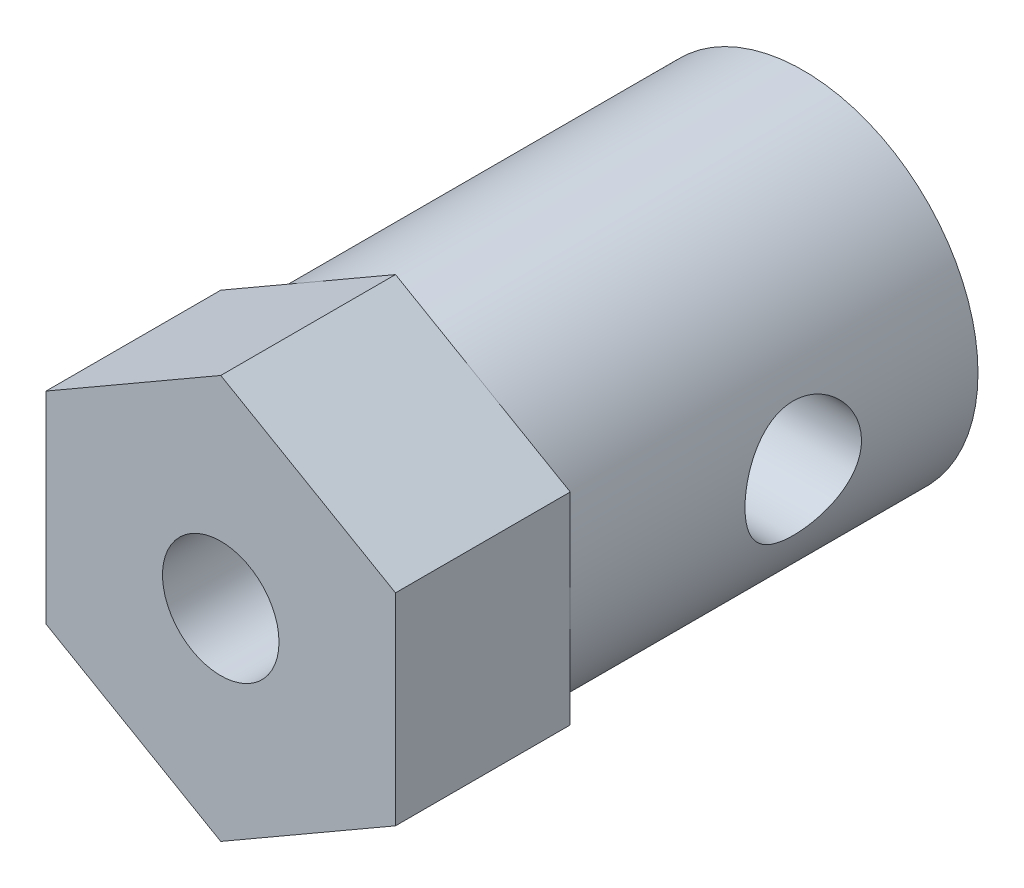
ISO-10303-21;
HEADER;
FILE_DESCRIPTION(('STEP AP214'),'2;1');
FILE_NAME('part.step','',(''),(''),'','','');
FILE_SCHEMA(('AUTOMOTIVE_DESIGN { 1 0 10303 214 1 1 1 1 }'));
ENDSEC;
DATA;
#1=APPLICATION_CONTEXT('core data for automotive mechanical design processes');
#2=APPLICATION_PROTOCOL_DEFINITION('international standard','automotive_design',2000,#1);
#3=PRODUCT_CONTEXT('',#1,'mechanical');
#4=PRODUCT('Part','Part','',(#3));
#5=PRODUCT_RELATED_PRODUCT_CATEGORY('part','',(#4));
#6=PRODUCT_DEFINITION_FORMATION('','',#4);
#7=PRODUCT_DEFINITION_CONTEXT('part definition',#1,'design');
#8=PRODUCT_DEFINITION('design','',#6,#7);
#9=PRODUCT_DEFINITION_SHAPE('','',#8);
#10=(LENGTH_UNIT() NAMED_UNIT(*) SI_UNIT(.MILLI.,.METRE.));
#11=(NAMED_UNIT(*) PLANE_ANGLE_UNIT() SI_UNIT($,.RADIAN.));
#12=(NAMED_UNIT(*) SI_UNIT($,.STERADIAN.) SOLID_ANGLE_UNIT());
#13=UNCERTAINTY_MEASURE_WITH_UNIT(LENGTH_MEASURE(1.E-05),#10,'distance_accuracy_value','');
#14=(GEOMETRIC_REPRESENTATION_CONTEXT(3) GLOBAL_UNCERTAINTY_ASSIGNED_CONTEXT((#13)) GLOBAL_UNIT_ASSIGNED_CONTEXT((#10,
#11,#12)) REPRESENTATION_CONTEXT('',''));
#15=CARTESIAN_POINT('',(0.,0.,0.));
#16=DIRECTION('',(0.,0.,1.));
#17=DIRECTION('',(1.,0.,0.));
#18=AXIS2_PLACEMENT_3D('',#15,#16,#17);
#19=CARTESIAN_POINT('',(0.,0.,118.));
#20=DIRECTION('',(0.,0.,1.));
#21=DIRECTION('',(1.,0.,0.));
#22=AXIS2_PLACEMENT_3D('',#19,#20,#21);
#23=CYLINDRICAL_SURFACE('',#22,2.);
#24=DIRECTION('',(0.,0.,1.));
#25=VECTOR('',#24,1.);
#26=CARTESIAN_POINT('',(2.,0.,118.));
#27=LINE('',#26,#25);
#28=CARTESIAN_POINT('',(2.,0.,118.));
#29=VERTEX_POINT('',#28);
#30=CARTESIAN_POINT('',(2.,0.,124.));
#31=VERTEX_POINT('',#30);
#32=EDGE_CURVE('E11',#29,#31,#27,.T.);
#33=ORIENTED_EDGE('',*,*,#32,.F.);
#34=CARTESIAN_POINT('',(0.,0.,118.));
#35=DIRECTION('',(0.,0.,1.));
#36=DIRECTION('',(1.,0.,0.));
#37=AXIS2_PLACEMENT_3D('',#34,#35,#36);
#38=CIRCLE('',#37,2.);
#39=EDGE_CURVE('E277',#29,#29,#38,.T.);
#40=ORIENTED_EDGE('',*,*,#39,.F.);
#41=ORIENTED_EDGE('',*,*,#32,.T.);
#42=CARTESIAN_POINT('',(0.,0.,124.));
#43=DIRECTION('',(0.,0.,1.));
#44=DIRECTION('',(1.,0.,0.));
#45=AXIS2_PLACEMENT_3D('',#42,#43,#44);
#46=CIRCLE('',#45,2.);
#47=EDGE_CURVE('E25',#31,#31,#46,.T.);
#48=ORIENTED_EDGE('',*,*,#47,.T.);
#49=EDGE_LOOP('',(#33,#40,#41,#48));
#50=FACE_BOUND('',#49,.T.);
#51=ADVANCED_FACE('F17',(#50),#23,.F.);
#52=CARTESIAN_POINT('',(0.,0.,124.));
#53=DIRECTION('',(0.,0.,1.));
#54=DIRECTION('',(1.,0.,0.));
#55=AXIS2_PLACEMENT_3D('',#52,#53,#54);
#56=PLANE('',#55);
#57=ORIENTED_EDGE('',*,*,#47,.F.);
#58=EDGE_LOOP('',(#57));
#59=FACE_BOUND('',#58,.T.);
#60=DIRECTION('',(-0.866025403784329,0.50000000000019,0.));
#61=VECTOR('',#60,1.);
#62=CARTESIAN_POINT('',(6.,3.464101615138,124.));
#63=LINE('',#62,#61);
#64=CARTESIAN_POINT('',(6.,3.464101615138,124.));
#65=VERTEX_POINT('',#64);
#66=CARTESIAN_POINT('',(0.,6.928203230276,124.));
#67=VERTEX_POINT('',#66);
#68=EDGE_CURVE('E308',#65,#67,#63,.T.);
#69=ORIENTED_EDGE('',*,*,#68,.T.);
#70=DIRECTION('',(-0.866025403784329,-0.50000000000019,0.));
#71=VECTOR('',#70,1.);
#72=CARTESIAN_POINT('',(0.,6.928203230276,124.));
#73=LINE('',#72,#71);
#74=CARTESIAN_POINT('',(-6.,3.464101615138,124.));
#75=VERTEX_POINT('',#74);
#76=EDGE_CURVE('E327',#67,#75,#73,.T.);
#77=ORIENTED_EDGE('',*,*,#76,.T.);
#78=DIRECTION('',(0.,-1.,0.));
#79=VECTOR('',#78,1.);
#80=CARTESIAN_POINT('',(-6.,3.464101615138,124.));
#81=LINE('',#80,#79);
#82=CARTESIAN_POINT('',(-6.,-3.464101615138,124.));
#83=VERTEX_POINT('',#82);
#84=EDGE_CURVE('E227',#75,#83,#81,.T.);
#85=ORIENTED_EDGE('',*,*,#84,.T.);
#86=DIRECTION('',(0.866025403784329,-0.50000000000019,0.));
#87=VECTOR('',#86,1.);
#88=CARTESIAN_POINT('',(-6.,-3.464101615138,124.));
#89=LINE('',#88,#87);
#90=CARTESIAN_POINT('',(0.,-6.928203230276,124.));
#91=VERTEX_POINT('',#90);
#92=EDGE_CURVE('E278',#83,#91,#89,.T.);
#93=ORIENTED_EDGE('',*,*,#92,.T.);
#94=DIRECTION('',(0.866025403784329,0.50000000000019,0.));
#95=VECTOR('',#94,1.);
#96=CARTESIAN_POINT('',(0.,-6.928203230276,124.));
#97=LINE('',#96,#95);
#98=CARTESIAN_POINT('',(6.,-3.464101615138,124.));
#99=VERTEX_POINT('',#98);
#100=EDGE_CURVE('E274',#91,#99,#97,.T.);
#101=ORIENTED_EDGE('',*,*,#100,.T.);
#102=DIRECTION('',(0.,1.,0.));
#103=VECTOR('',#102,1.);
#104=CARTESIAN_POINT('',(6.,-3.464101615138,124.));
#105=LINE('',#104,#103);
#106=EDGE_CURVE('E313',#99,#65,#105,.T.);
#107=ORIENTED_EDGE('',*,*,#106,.T.);
#108=EDGE_LOOP('',(#69,#77,#85,#93,#101,#107));
#109=FACE_BOUND('',#108,.T.);
#110=ADVANCED_FACE('F342',(#59,#109),#56,.T.);
#111=CARTESIAN_POINT('',(0.,0.,118.));
#112=DIRECTION('',(0.,0.,1.));
#113=DIRECTION('',(1.,0.,0.));
#114=AXIS2_PLACEMENT_3D('',#111,#112,#113);
#115=PLANE('',#114);
#116=ORIENTED_EDGE('',*,*,#39,.T.);
#117=EDGE_LOOP('',(#116));
#118=FACE_BOUND('',#117,.T.);
#119=CARTESIAN_POINT('',(0.,0.,118.));
#120=DIRECTION('',(0.,0.,1.));
#121=DIRECTION('',(1.,0.,0.));
#122=AXIS2_PLACEMENT_3D('',#119,#120,#121);
#123=CIRCLE('',#122,3.1);
#124=CARTESIAN_POINT('',(3.1,0.,118.));
#125=VERTEX_POINT('',#124);
#126=EDGE_CURVE('E201',#125,#125,#123,.T.);
#127=ORIENTED_EDGE('',*,*,#126,.F.);
#128=EDGE_LOOP('',(#127));
#129=FACE_BOUND('',#128,.T.);
#130=ADVANCED_FACE('F345',(#118,#129),#115,.F.);
#131=CARTESIAN_POINT('',(0.,-6.928203230276,118.));
#132=DIRECTION('',(-0.50000000000019,0.866025403784329,0.));
#133=DIRECTION('',(0.,0.,1.));
#134=AXIS2_PLACEMENT_3D('',#131,#132,#133);
#135=PLANE('',#134);
#136=DIRECTION('',(0.866025403784329,0.50000000000019,0.));
#137=VECTOR('',#136,1.);
#138=CARTESIAN_POINT('',(0.,-6.928203230276,118.));
#139=LINE('',#138,#137);
#140=CARTESIAN_POINT('',(0.,-6.928203230276,118.));
#141=VERTEX_POINT('',#140);
#142=CARTESIAN_POINT('',(3.000000060816,-5.196152387594,118.));
#143=VERTEX_POINT('',#142);
#144=EDGE_CURVE('E236',#141,#143,#139,.T.);
#145=ORIENTED_EDGE('',*,*,#144,.T.);
#146=DIRECTION('',(0.866025403784329,0.50000000000019,0.));
#147=VECTOR('',#146,1.);
#148=CARTESIAN_POINT('',(0.,-6.928203230276,118.));
#149=LINE('',#148,#147);
#150=CARTESIAN_POINT('',(6.,-3.464101615138,118.));
#151=VERTEX_POINT('',#150);
#152=EDGE_CURVE('E291',#143,#151,#149,.T.);
#153=ORIENTED_EDGE('',*,*,#152,.T.);
#154=DIRECTION('',(0.,0.,1.));
#155=VECTOR('',#154,1.);
#156=CARTESIAN_POINT('',(6.,-3.464101615138,118.));
#157=LINE('',#156,#155);
#158=EDGE_CURVE('E309',#151,#99,#157,.T.);
#159=ORIENTED_EDGE('',*,*,#158,.T.);
#160=ORIENTED_EDGE('',*,*,#100,.F.);
#161=DIRECTION('',(0.,0.,1.));
#162=VECTOR('',#161,1.);
#163=CARTESIAN_POINT('',(0.,-6.928203230276,118.));
#164=LINE('',#163,#162);
#165=EDGE_CURVE('E231',#141,#91,#164,.T.);
#166=ORIENTED_EDGE('',*,*,#165,.F.);
#167=EDGE_LOOP('',(#145,#153,#159,#160,#166));
#168=FACE_BOUND('',#167,.T.);
#169=ADVANCED_FACE('F360',(#168),#135,.F.);
#170=CARTESIAN_POINT('',(-6.,-3.464101615138,118.));
#171=DIRECTION('',(0.50000000000019,0.866025403784329,0.));
#172=DIRECTION('',(0.,0.,-1.));
#173=AXIS2_PLACEMENT_3D('',#170,#171,#172);
#174=PLANE('',#173);
#175=DIRECTION('',(0.866025403784329,-0.50000000000019,0.));
#176=VECTOR('',#175,1.);
#177=CARTESIAN_POINT('',(-6.,-3.464101615138,118.));
#178=LINE('',#177,#176);
#179=CARTESIAN_POINT('',(-6.,-3.464101615138,118.));
#180=VERTEX_POINT('',#179);
#181=CARTESIAN_POINT('',(-2.999999968331,-5.196152440991,118.));
#182=VERTEX_POINT('',#181);
#183=EDGE_CURVE('E273',#180,#182,#178,.T.);
#184=ORIENTED_EDGE('',*,*,#183,.T.);
#185=DIRECTION('',(0.866025403784329,-0.50000000000019,0.));
#186=VECTOR('',#185,1.);
#187=CARTESIAN_POINT('',(-6.,-3.464101615138,118.));
#188=LINE('',#187,#186);
#189=EDGE_CURVE('E233',#182,#141,#188,.T.);
#190=ORIENTED_EDGE('',*,*,#189,.T.);
#191=ORIENTED_EDGE('',*,*,#165,.T.);
#192=ORIENTED_EDGE('',*,*,#92,.F.);
#193=DIRECTION('',(0.,0.,1.));
#194=VECTOR('',#193,1.);
#195=CARTESIAN_POINT('',(-6.,-3.464101615138,118.));
#196=LINE('',#195,#194);
#197=EDGE_CURVE('E232',#180,#83,#196,.T.);
#198=ORIENTED_EDGE('',*,*,#197,.F.);
#199=EDGE_LOOP('',(#184,#190,#191,#192,#198));
#200=FACE_BOUND('',#199,.T.);
#201=ADVANCED_FACE('F357',(#200),#174,.F.);
#202=CARTESIAN_POINT('',(-6.,3.464101615138,118.));
#203=DIRECTION('',(1.,0.,0.));
#204=DIRECTION('',(0.,-1.,0.));
#205=AXIS2_PLACEMENT_3D('',#202,#203,#204);
#206=PLANE('',#205);
#207=DIRECTION('',(0.,-1.,0.));
#208=VECTOR('',#207,1.);
#209=CARTESIAN_POINT('',(-6.,3.464101615138,118.));
#210=LINE('',#209,#208);
#211=CARTESIAN_POINT('',(-6.,3.464101615138,118.));
#212=VERTEX_POINT('',#211);
#213=CARTESIAN_POINT('',(-6.,0.,118.));
#214=VERTEX_POINT('',#213);
#215=EDGE_CURVE('E265',#212,#214,#210,.T.);
#216=ORIENTED_EDGE('',*,*,#215,.T.);
#217=DIRECTION('',(0.,-1.,0.));
#218=VECTOR('',#217,1.);
#219=CARTESIAN_POINT('',(-6.,3.464101615138,118.));
#220=LINE('',#219,#218);
#221=EDGE_CURVE('E237',#214,#180,#220,.T.);
#222=ORIENTED_EDGE('',*,*,#221,.T.);
#223=ORIENTED_EDGE('',*,*,#197,.T.);
#224=ORIENTED_EDGE('',*,*,#84,.F.);
#225=DIRECTION('',(0.,0.,1.));
#226=VECTOR('',#225,1.);
#227=CARTESIAN_POINT('',(-6.,3.464101615138,118.));
#228=LINE('',#227,#226);
#229=EDGE_CURVE('E323',#212,#75,#228,.T.);
#230=ORIENTED_EDGE('',*,*,#229,.F.);
#231=EDGE_LOOP('',(#216,#222,#223,#224,#230));
#232=FACE_BOUND('',#231,.T.);
#233=ADVANCED_FACE('F355',(#232),#206,.F.);
#234=CARTESIAN_POINT('',(0.,6.928203230276,118.));
#235=DIRECTION('',(0.50000000000019,-0.866025403784329,0.));
#236=DIRECTION('',(0.,0.,-1.));
#237=AXIS2_PLACEMENT_3D('',#234,#235,#236);
#238=PLANE('',#237);
#239=DIRECTION('',(-0.866025403784329,-0.50000000000019,0.));
#240=VECTOR('',#239,1.);
#241=CARTESIAN_POINT('',(0.,6.928203230276,118.));
#242=LINE('',#241,#240);
#243=CARTESIAN_POINT('',(0.,6.928203230276,118.));
#244=VERTEX_POINT('',#243);
#245=CARTESIAN_POINT('',(-3.000000060816,5.196152387594,118.));
#246=VERTEX_POINT('',#245);
#247=EDGE_CURVE('E257',#244,#246,#242,.T.);
#248=ORIENTED_EDGE('',*,*,#247,.T.);
#249=DIRECTION('',(-0.866025403784329,-0.50000000000019,0.));
#250=VECTOR('',#249,1.);
#251=CARTESIAN_POINT('',(0.,6.928203230276,118.));
#252=LINE('',#251,#250);
#253=EDGE_CURVE('E269',#246,#212,#252,.T.);
#254=ORIENTED_EDGE('',*,*,#253,.T.);
#255=ORIENTED_EDGE('',*,*,#229,.T.);
#256=ORIENTED_EDGE('',*,*,#76,.F.);
#257=DIRECTION('',(0.,0.,1.));
#258=VECTOR('',#257,1.);
#259=CARTESIAN_POINT('',(0.,6.928203230276,118.));
#260=LINE('',#259,#258);
#261=EDGE_CURVE('E304',#244,#67,#260,.T.);
#262=ORIENTED_EDGE('',*,*,#261,.F.);
#263=EDGE_LOOP('',(#248,#254,#255,#256,#262));
#264=FACE_BOUND('',#263,.T.);
#265=ADVANCED_FACE('F352',(#264),#238,.F.);
#266=CARTESIAN_POINT('',(6.,3.464101615138,118.));
#267=DIRECTION('',(-0.50000000000019,-0.866025403784329,0.));
#268=DIRECTION('',(-0.866025403784329,0.50000000000019,0.));
#269=AXIS2_PLACEMENT_3D('',#266,#267,#268);
#270=PLANE('',#269);
#271=DIRECTION('',(-0.866025403784329,0.50000000000019,0.));
#272=VECTOR('',#271,1.);
#273=CARTESIAN_POINT('',(6.,3.464101615138,118.));
#274=LINE('',#273,#272);
#275=CARTESIAN_POINT('',(6.,3.464101615138,118.));
#276=VERTEX_POINT('',#275);
#277=CARTESIAN_POINT('',(3.000000043153,5.196152397792,118.));
#278=VERTEX_POINT('',#277);
#279=EDGE_CURVE('E184',#276,#278,#274,.T.);
#280=ORIENTED_EDGE('',*,*,#279,.T.);
#281=DIRECTION('',(-0.866025403784329,0.50000000000019,0.));
#282=VECTOR('',#281,1.);
#283=CARTESIAN_POINT('',(6.,3.464101615138,118.));
#284=LINE('',#283,#282);
#285=EDGE_CURVE('E261',#278,#244,#284,.T.);
#286=ORIENTED_EDGE('',*,*,#285,.T.);
#287=ORIENTED_EDGE('',*,*,#261,.T.);
#288=ORIENTED_EDGE('',*,*,#68,.F.);
#289=DIRECTION('',(0.,0.,1.));
#290=VECTOR('',#289,1.);
#291=CARTESIAN_POINT('',(6.,3.464101615138,118.));
#292=LINE('',#291,#290);
#293=EDGE_CURVE('E204',#276,#65,#292,.T.);
#294=ORIENTED_EDGE('',*,*,#293,.F.);
#295=EDGE_LOOP('',(#280,#286,#287,#288,#294));
#296=FACE_BOUND('',#295,.T.);
#297=ADVANCED_FACE('F349',(#296),#270,.F.);
#298=CARTESIAN_POINT('',(6.,-3.464101615138,118.));
#299=DIRECTION('',(-1.,0.,0.));
#300=DIRECTION('',(0.,0.,1.));
#301=AXIS2_PLACEMENT_3D('',#298,#299,#300);
#302=PLANE('',#301);
#303=DIRECTION('',(0.,1.,0.));
#304=VECTOR('',#303,1.);
#305=CARTESIAN_POINT('',(6.,-3.464101615138,118.));
#306=LINE('',#305,#304);
#307=CARTESIAN_POINT('',(6.,0.,118.));
#308=VERTEX_POINT('',#307);
#309=EDGE_CURVE('E295',#151,#308,#306,.T.);
#310=ORIENTED_EDGE('',*,*,#309,.T.);
#311=DIRECTION('',(0.,1.,0.));
#312=VECTOR('',#311,1.);
#313=CARTESIAN_POINT('',(6.,-3.464101615138,118.));
#314=LINE('',#313,#312);
#315=EDGE_CURVE('E250',#308,#276,#314,.T.);
#316=ORIENTED_EDGE('',*,*,#315,.T.);
#317=ORIENTED_EDGE('',*,*,#293,.T.);
#318=ORIENTED_EDGE('',*,*,#106,.F.);
#319=ORIENTED_EDGE('',*,*,#158,.F.);
#320=EDGE_LOOP('',(#310,#316,#317,#318,#319));
#321=FACE_BOUND('',#320,.T.);
#322=ADVANCED_FACE('F369',(#321),#302,.F.);
#323=CARTESIAN_POINT('',(0.,0.,104.));
#324=DIRECTION('',(0.,0.,1.));
#325=DIRECTION('',(1.,0.,0.));
#326=AXIS2_PLACEMENT_3D('',#323,#324,#325);
#327=CYLINDRICAL_SURFACE('',#326,3.1);
#328=CARTESIAN_POINT('',(3.1,0.,112.));
#329=CARTESIAN_POINT('',(3.1,-0.145810340071,112.));
#330=CARTESIAN_POINT('',(3.091769834637,-0.290551809947,111.98724354649));
#331=CARTESIAN_POINT('',(3.075537316906,-0.432081948247,111.96208169678));
#332=CARTESIAN_POINT('',(3.052163030582,-0.568317068647,111.9254989852));
#333=CARTESIAN_POINT('',(3.023116457562,-0.697347590082,111.87910923072));
#334=CARTESIAN_POINT('',(2.975661529984,-0.870919328125,111.8013661878));
#335=CARTESIAN_POINT('',(2.960258287207,-0.92276356283,111.77589628021));
#336=CARTESIAN_POINT('',(2.94415341791,-0.973065475789,111.74897776907));
#337=CARTESIAN_POINT('',(2.927451577499,-1.021819929246,111.72071735709));
#338=CARTESIAN_POINT('',(2.910253730366,-1.06902667742,111.69121457238));
#339=CARTESIAN_POINT('',(2.850556580819,-1.223942689664,111.58722362802));
#340=CARTESIAN_POINT('',(2.806156768652,-1.324403760344,111.507274547));
#341=CARTESIAN_POINT('',(2.760688741122,-1.416366879895,111.42180626788));
#342=CARTESIAN_POINT('',(2.715203541701,-1.500173578232,111.33156463755));
#343=CARTESIAN_POINT('',(2.670644063386,-1.576115695881,111.23702544624));
#344=CARTESIAN_POINT('',(2.590416677366,-1.704331686998,111.05183365759));
#345=CARTESIAN_POINT('',(2.554298929966,-1.758401976101,110.96203582767));
#346=CARTESIAN_POINT('',(2.520295124674,-1.806551201795,110.86940058415));
#347=CARTESIAN_POINT('',(2.489104064137,-1.848750910862,110.77420191365));
#348=CARTESIAN_POINT('',(2.46139665861,-1.884936690285,110.67665566491));
#349=CARTESIAN_POINT('',(2.415806901366,-1.94297295719,110.48401591855));
#350=CARTESIAN_POINT('',(2.397369318849,-1.965650337343,110.38915886917));
#351=CARTESIAN_POINT('',(2.383085574252,-1.982778697415,110.29288535359));
#352=CARTESIAN_POINT('',(2.373399219343,-1.994249917229,110.19565841736));
#353=CARTESIAN_POINT('',(2.368543856465,-2.,110.09789558106));
#354=CARTESIAN_POINT('',(2.368543856465,-2.,109.90163938271));
#355=CARTESIAN_POINT('',(2.373445456771,-1.994195159064,109.80341448172));
#356=CARTESIAN_POINT('',(2.383223625459,-1.982615208966,109.70573312931));
#357=CARTESIAN_POINT('',(2.397640437756,-1.96532519103,109.60901788994));
#358=CARTESIAN_POINT('',(2.416244384248,-1.942434803537,109.51373784101));
#359=CARTESIAN_POINT('',(2.461991686327,-1.884158712171,109.32126447523));
#360=CARTESIAN_POINT('',(2.489613737056,-1.848059183636,109.22426333442));
#361=CARTESIAN_POINT('',(2.520674707014,-1.80600907435,109.12958916862));
#362=CARTESIAN_POINT('',(2.554513991592,-1.758071509816,109.03745429295));
#363=CARTESIAN_POINT('',(2.590443930358,-1.704274182552,108.9481279909));
#364=CARTESIAN_POINT('',(2.670642523975,-1.576134109134,108.76295002324));
#365=CARTESIAN_POINT('',(2.71539063114,-1.499871666418,108.66802162483));
#366=CARTESIAN_POINT('',(2.761070787407,-1.415679391216,108.5774262761));
#367=CARTESIAN_POINT('',(2.806728710878,-1.323261002982,108.49164589375));
#368=CARTESIAN_POINT('',(2.85129940242,-1.222270223416,108.41143753683));
#369=CARTESIAN_POINT('',(2.911445462619,-1.065822067505,108.30672915412));
#370=CARTESIAN_POINT('',(2.928939862758,-1.017629557278,108.27674370663));
#371=CARTESIAN_POINT('',(2.945914163533,-0.967829663718,108.24805285342));
#372=CARTESIAN_POINT('',(2.962261097153,-0.916423679482,108.22076272214));
#373=CARTESIAN_POINT('',(2.977869536058,-0.863418269738,108.19498697727));
#374=CARTESIAN_POINT('',(3.024842291586,-0.689620802261,108.11813621363));
#375=CARTESIAN_POINT('',(3.053272834563,-0.561807776421,108.07276392643));
#376=CARTESIAN_POINT('',(3.076120320689,-0.426993751364,108.03701452167));
#377=CARTESIAN_POINT('',(3.091970344326,-0.287052523534,108.01244570026));
#378=CARTESIAN_POINT('',(3.1,-0.144023374511,108.));
#379=CARTESIAN_POINT('',(3.1,0.,108.));
#380=(BOUNDED_CURVE() B_SPLINE_CURVE(6,(#328,#329,#330,#331,#332,#333,#334,#335,#336,#337,#338,
#339,#340,#341,#342,#343,#344,#345,#346,#347,#348,#349,#350,#351,#352,#353,#354,#355,#356,#357,
#358,#359,#360,#361,#362,#363,#364,#365,#366,#367,#368,#369,#370,#371,#372,#373,#374,#375,#376,
#377,#378,#379),.UNSPECIFIED.,.F.,.F.) B_SPLINE_CURVE_WITH_KNOTS((7,5,5,5,5,5,5,5,5,5,7),(0.,
0.116004523793,0.167520041718,0.290773114873,0.399091347114,0.499998042746,0.601384078378,
0.709141906393,0.832907345867,0.885394045329,1.),
.UNSPECIFIED.) CURVE() GEOMETRIC_REPRESENTATION_ITEM() RATIONAL_B_SPLINE_CURVE((1.,1.,1.,1.,1.,
1.,1.,1.,1.,1.,1.,1.,1.,1.,1.,1.,1.,1.,1.,1.,1.,1.,1.,1.,1.,1.,1.,1.,1.,1.,1.,1.,1.,1.,1.,1.,1.,
1.,1.,1.,1.,1.,1.,1.,1.,1.,1.,1.,1.,1.,1.,1.)) REPRESENTATION_ITEM(''));
#381=CARTESIAN_POINT('',(3.1,0.,112.));
#382=VERTEX_POINT('',#381);
#383=CARTESIAN_POINT('',(3.1,0.,108.));
#384=VERTEX_POINT('',#383);
#385=EDGE_CURVE('E151',#382,#384,#380,.T.);
#386=ORIENTED_EDGE('',*,*,#385,.T.);
#387=DIRECTION('',(0.,0.,1.));
#388=VECTOR('',#387,1.);
#389=CARTESIAN_POINT('',(3.1,0.,104.));
#390=LINE('',#389,#388);
#391=CARTESIAN_POINT('',(3.1,0.,104.));
#392=VERTEX_POINT('',#391);
#393=EDGE_CURVE('E298',#392,#384,#390,.T.);
#394=ORIENTED_EDGE('',*,*,#393,.F.);
#395=CARTESIAN_POINT('',(0.,0.,104.));
#396=DIRECTION('',(0.,0.,1.));
#397=DIRECTION('',(1.,0.,0.));
#398=AXIS2_PLACEMENT_3D('',#395,#396,#397);
#399=CIRCLE('',#398,3.1);
#400=EDGE_CURVE('E214',#392,#392,#399,.T.);
#401=ORIENTED_EDGE('',*,*,#400,.F.);
#402=ORIENTED_EDGE('',*,*,#393,.T.);
#403=CARTESIAN_POINT('',(3.1,0.,108.));
#404=CARTESIAN_POINT('',(3.1,0.145810340142,108.));
#405=CARTESIAN_POINT('',(3.091769834629,0.290551809931,108.01275645351));
#406=CARTESIAN_POINT('',(3.075537316916,0.432081948177,108.0379183032));
#407=CARTESIAN_POINT('',(3.052163030594,0.568317068627,108.07450101477));
#408=CARTESIAN_POINT('',(3.023116457544,0.697347590147,108.1208907693));
#409=CARTESIAN_POINT('',(2.975661532319,0.870919319587,108.19863380837));
#410=CARTESIAN_POINT('',(2.960258286442,0.922763564123,108.22410372118));
#411=CARTESIAN_POINT('',(2.944153415417,0.973065483456,108.25102223514));
#412=CARTESIAN_POINT('',(2.927451576879,1.02181993215,108.27928264385));
#413=CARTESIAN_POINT('',(2.910253732881,1.069026670895,108.30878542323));
#414=CARTESIAN_POINT('',(2.850556580829,1.223942689636,108.41277637195));
#415=CARTESIAN_POINT('',(2.806156768636,1.324403760389,108.49272545302));
#416=CARTESIAN_POINT('',(2.760688741121,1.416366879882,108.57819373213));
#417=CARTESIAN_POINT('',(2.715203541717,1.500173578211,108.6684353624));
#418=CARTESIAN_POINT('',(2.670644063376,1.576115695896,108.76297455377));
#419=CARTESIAN_POINT('',(2.590416677366,1.704331686998,108.9481663424));
#420=CARTESIAN_POINT('',(2.554298929966,1.758401976101,109.03796417232));
#421=CARTESIAN_POINT('',(2.520295124674,1.806551201795,109.13059941584));
#422=CARTESIAN_POINT('',(2.489104064137,1.848750910862,109.22579808634));
#423=CARTESIAN_POINT('',(2.46139665861,1.884936690285,109.32334433508));
#424=CARTESIAN_POINT('',(2.415806901366,1.94297295719,109.51598408144));
#425=CARTESIAN_POINT('',(2.397369318849,1.965650337343,109.61084113083));
#426=CARTESIAN_POINT('',(2.383085574252,1.982778697415,109.7071146464));
#427=CARTESIAN_POINT('',(2.373399219343,1.994249917229,109.80434158263));
#428=CARTESIAN_POINT('',(2.368543856465,2.,109.90210441893));
#429=CARTESIAN_POINT('',(2.368543856465,2.,110.09836061728));
#430=CARTESIAN_POINT('',(2.373445456771,1.994195159064,110.19658551827));
#431=CARTESIAN_POINT('',(2.383223625459,1.982615208966,110.29426687068));
#432=CARTESIAN_POINT('',(2.397640437756,1.96532519103,110.39098211005));
#433=CARTESIAN_POINT('',(2.416244384248,1.942434803537,110.48626215898));
#434=CARTESIAN_POINT('',(2.461991686327,1.884158712171,110.67873552476));
#435=CARTESIAN_POINT('',(2.489613737056,1.848059183636,110.77573666557));
#436=CARTESIAN_POINT('',(2.520674707014,1.80600907435,110.87041083137));
#437=CARTESIAN_POINT('',(2.554513991592,1.758071509816,110.96254570704));
#438=CARTESIAN_POINT('',(2.590443930358,1.704274182552,111.05187200909));
#439=CARTESIAN_POINT('',(2.670642523975,1.576134109134,111.23704997675));
#440=CARTESIAN_POINT('',(2.71539063114,1.499871666418,111.33197837516));
#441=CARTESIAN_POINT('',(2.761070787407,1.415679391216,111.42257372389));
#442=CARTESIAN_POINT('',(2.806728710878,1.323261002982,111.50835410624));
#443=CARTESIAN_POINT('',(2.85129940242,1.222270223416,111.58856246316));
#444=CARTESIAN_POINT('',(2.911445462619,1.065822067505,111.69327084587));
#445=CARTESIAN_POINT('',(2.928939862758,1.017629557278,111.72325629336));
#446=CARTESIAN_POINT('',(2.945914163533,0.967829663718,111.75194714658));
#447=CARTESIAN_POINT('',(2.962261097153,0.916423679482,111.77923727786));
#448=CARTESIAN_POINT('',(2.977869536058,0.863418269738,111.80501302272));
#449=CARTESIAN_POINT('',(3.024842291586,0.689620802261,111.88186378637));
#450=CARTESIAN_POINT('',(3.053272834563,0.561807776421,111.92723607356));
#451=CARTESIAN_POINT('',(3.076120320689,0.426993751364,111.96298547832));
#452=CARTESIAN_POINT('',(3.091970344326,0.287052523534,111.98755429973));
#453=CARTESIAN_POINT('',(3.1,0.144023374511,112.));
#454=CARTESIAN_POINT('',(3.1,0.,112.));
#455=(BOUNDED_CURVE() B_SPLINE_CURVE(6,(#403,#404,#405,#406,#407,#408,#409,#410,#411,#412,#413,
#414,#415,#416,#417,#418,#419,#420,#421,#422,#423,#424,#425,#426,#427,#428,#429,#430,#431,#432,
#433,#434,#435,#436,#437,#438,#439,#440,#441,#442,#443,#444,#445,#446,#447,#448,#449,#450,#451,
#452,#453,#454),.UNSPECIFIED.,.F.,.F.) B_SPLINE_CURVE_WITH_KNOTS((7,5,5,5,5,5,5,5,5,5,7),(0.,
0.116004553949,0.167520077053,0.290773144954,0.399091372601,0.499998063954,0.601384095285,
0.70914191873,0.832907352954,0.88539405019,1.),
.UNSPECIFIED.) CURVE() GEOMETRIC_REPRESENTATION_ITEM() RATIONAL_B_SPLINE_CURVE((1.,1.,1.,1.,1.,
1.,1.,1.,1.,1.,1.,1.,1.,1.,1.,1.,1.,1.,1.,1.,1.,1.,1.,1.,1.,1.,1.,1.,1.,1.,1.,1.,1.,1.,1.,1.,1.,
1.,1.,1.,1.,1.,1.,1.,1.,1.,1.,1.,1.,1.,1.,1.)) REPRESENTATION_ITEM(''));
#456=EDGE_CURVE('E154',#384,#382,#455,.T.);
#457=ORIENTED_EDGE('',*,*,#456,.T.);
#458=DIRECTION('',(0.,0.,1.));
#459=VECTOR('',#458,1.);
#460=CARTESIAN_POINT('',(3.1,0.,104.));
#461=LINE('',#460,#459);
#462=EDGE_CURVE('E205',#382,#125,#461,.T.);
#463=ORIENTED_EDGE('',*,*,#462,.T.);
#464=ORIENTED_EDGE('',*,*,#126,.T.);
#465=ORIENTED_EDGE('',*,*,#462,.F.);
#466=EDGE_LOOP('',(#386,#394,#401,#402,#457,#463,#464,#465));
#467=FACE_BOUND('',#466,.T.);
#468=ADVANCED_FACE('F442',(#467),#327,.F.);
#469=CARTESIAN_POINT('',(0.,0.,118.));
#470=DIRECTION('',(0.,0.,1.));
#471=DIRECTION('',(1.,0.,0.));
#472=AXIS2_PLACEMENT_3D('',#469,#470,#471);
#473=PLANE('',#472);
#474=ORIENTED_EDGE('',*,*,#152,.F.);
#475=CARTESIAN_POINT('',(0.,0.,118.));
#476=DIRECTION('',(0.,0.,1.));
#477=DIRECTION('',(1.,0.,0.));
#478=AXIS2_PLACEMENT_3D('',#475,#476,#477);
#479=CIRCLE('',#478,6.);
#480=EDGE_CURVE('E175',#143,#308,#479,.T.);
#481=ORIENTED_EDGE('',*,*,#480,.T.);
#482=ORIENTED_EDGE('',*,*,#309,.F.);
#483=EDGE_LOOP('',(#474,#481,#482));
#484=FACE_BOUND('',#483,.T.);
#485=ADVANCED_FACE('F367',(#484),#473,.F.);
#486=CARTESIAN_POINT('',(0.,0.,118.));
#487=DIRECTION('',(0.,0.,1.));
#488=DIRECTION('',(1.,0.,0.));
#489=AXIS2_PLACEMENT_3D('',#486,#487,#488);
#490=PLANE('',#489);
#491=ORIENTED_EDGE('',*,*,#189,.F.);
#492=CARTESIAN_POINT('',(0.,0.,118.));
#493=DIRECTION('',(0.,0.,1.));
#494=DIRECTION('',(1.,0.,0.));
#495=AXIS2_PLACEMENT_3D('',#492,#493,#494);
#496=CIRCLE('',#495,6.);
#497=EDGE_CURVE('E195',#182,#143,#496,.T.);
#498=ORIENTED_EDGE('',*,*,#497,.T.);
#499=ORIENTED_EDGE('',*,*,#144,.F.);
#500=EDGE_LOOP('',(#491,#498,#499));
#501=FACE_BOUND('',#500,.T.);
#502=ADVANCED_FACE('F362',(#501),#490,.F.);
#503=CARTESIAN_POINT('',(0.,0.,118.));
#504=DIRECTION('',(0.,0.,1.));
#505=DIRECTION('',(1.,0.,0.));
#506=AXIS2_PLACEMENT_3D('',#503,#504,#505);
#507=PLANE('',#506);
#508=ORIENTED_EDGE('',*,*,#183,.F.);
#509=ORIENTED_EDGE('',*,*,#221,.F.);
#510=CARTESIAN_POINT('',(0.,0.,118.));
#511=DIRECTION('',(0.,0.,1.));
#512=DIRECTION('',(1.,0.,0.));
#513=AXIS2_PLACEMENT_3D('',#510,#511,#512);
#514=CIRCLE('',#513,6.);
#515=EDGE_CURVE('E194',#214,#182,#514,.T.);
#516=ORIENTED_EDGE('',*,*,#515,.T.);
#517=EDGE_LOOP('',(#508,#509,#516));
#518=FACE_BOUND('',#517,.T.);
#519=ADVANCED_FACE('F387',(#518),#507,.F.);
#520=CARTESIAN_POINT('',(0.,0.,118.));
#521=DIRECTION('',(0.,0.,1.));
#522=DIRECTION('',(1.,0.,0.));
#523=AXIS2_PLACEMENT_3D('',#520,#521,#522);
#524=PLANE('',#523);
#525=ORIENTED_EDGE('',*,*,#215,.F.);
#526=ORIENTED_EDGE('',*,*,#253,.F.);
#527=CARTESIAN_POINT('',(0.,0.,118.));
#528=DIRECTION('',(0.,0.,1.));
#529=DIRECTION('',(1.,0.,0.));
#530=AXIS2_PLACEMENT_3D('',#527,#528,#529);
#531=CIRCLE('',#530,6.);
#532=EDGE_CURVE('E189',#246,#214,#531,.T.);
#533=ORIENTED_EDGE('',*,*,#532,.T.);
#534=EDGE_LOOP('',(#525,#526,#533));
#535=FACE_BOUND('',#534,.T.);
#536=ADVANCED_FACE('F378',(#535),#524,.F.);
#537=CARTESIAN_POINT('',(0.,0.,118.));
#538=DIRECTION('',(0.,0.,1.));
#539=DIRECTION('',(1.,0.,0.));
#540=AXIS2_PLACEMENT_3D('',#537,#538,#539);
#541=PLANE('',#540);
#542=ORIENTED_EDGE('',*,*,#247,.F.);
#543=ORIENTED_EDGE('',*,*,#285,.F.);
#544=CARTESIAN_POINT('',(0.,0.,118.));
#545=DIRECTION('',(0.,0.,1.));
#546=DIRECTION('',(1.,0.,0.));
#547=AXIS2_PLACEMENT_3D('',#544,#545,#546);
#548=CIRCLE('',#547,6.);
#549=EDGE_CURVE('E193',#278,#246,#548,.T.);
#550=ORIENTED_EDGE('',*,*,#549,.T.);
#551=EDGE_LOOP('',(#542,#543,#550));
#552=FACE_BOUND('',#551,.T.);
#553=ADVANCED_FACE('F376',(#552),#541,.F.);
#554=CARTESIAN_POINT('',(0.,0.,118.));
#555=DIRECTION('',(0.,0.,1.));
#556=DIRECTION('',(1.,0.,0.));
#557=AXIS2_PLACEMENT_3D('',#554,#555,#556);
#558=PLANE('',#557);
#559=CARTESIAN_POINT('',(0.,0.,118.));
#560=DIRECTION('',(0.,0.,1.));
#561=DIRECTION('',(1.,0.,0.));
#562=AXIS2_PLACEMENT_3D('',#559,#560,#561);
#563=CIRCLE('',#562,6.);
#564=EDGE_CURVE('E164',#308,#278,#563,.T.);
#565=ORIENTED_EDGE('',*,*,#564,.T.);
#566=ORIENTED_EDGE('',*,*,#279,.F.);
#567=ORIENTED_EDGE('',*,*,#315,.F.);
#568=EDGE_LOOP('',(#565,#566,#567));
#569=FACE_BOUND('',#568,.T.);
#570=ADVANCED_FACE('F373',(#569),#558,.F.);
#571=CARTESIAN_POINT('',(0.,0.,104.));
#572=DIRECTION('',(0.,0.,1.));
#573=DIRECTION('',(1.,0.,0.));
#574=AXIS2_PLACEMENT_3D('',#571,#572,#573);
#575=PLANE('',#574);
#576=ORIENTED_EDGE('',*,*,#400,.T.);
#577=EDGE_LOOP('',(#576));
#578=FACE_BOUND('',#577,.T.);
#579=CARTESIAN_POINT('',(0.,0.,104.));
#580=DIRECTION('',(0.,0.,1.));
#581=DIRECTION('',(1.,0.,0.));
#582=AXIS2_PLACEMENT_3D('',#579,#580,#581);
#583=CIRCLE('',#582,6.);
#584=CARTESIAN_POINT('',(6.,0.,104.));
#585=VERTEX_POINT('',#584);
#586=EDGE_CURVE('E155',#585,#585,#583,.T.);
#587=ORIENTED_EDGE('',*,*,#586,.F.);
#588=EDGE_LOOP('',(#587));
#589=FACE_BOUND('',#588,.T.);
#590=ADVANCED_FACE('F385',(#578,#589),#575,.F.);
#591=CARTESIAN_POINT('',(0.,0.,110.));
#592=DIRECTION('',(1.,0.,0.));
#593=DIRECTION('',(0.,0.,1.));
#594=AXIS2_PLACEMENT_3D('',#591,#592,#593);
#595=CYLINDRICAL_SURFACE('',#594,2.);
#596=CARTESIAN_POINT('',(6.,0.,108.));
#597=CARTESIAN_POINT('',(6.,0.111833147637,108.));
#598=CARTESIAN_POINT('',(5.997498676926,0.223474476105,108.00750400501));
#599=CARTESIAN_POINT('',(5.992512069516,0.333888421146,108.0224636595));
#600=CARTESIAN_POINT('',(5.985202976956,0.442050898916,108.04457905237));
#601=CARTESIAN_POINT('',(5.975875662162,0.546991269959,108.07330281242));
#602=CARTESIAN_POINT('',(5.95009318486,0.784382794865,108.15458009796));
#603=CARTESIAN_POINT('',(5.932286853489,0.913389439328,108.21195969733));
#604=CARTESIAN_POINT('',(5.912314370746,1.034243199657,108.27849214264));
#605=CARTESIAN_POINT('',(5.891008395688,1.146539425974,108.35279753258));
#606=CARTESIAN_POINT('',(5.869141204997,1.250044222852,108.43356050681));
#607=CARTESIAN_POINT('',(5.837408348134,1.388035708727,108.55889359967));
#608=CARTESIAN_POINT('',(5.827448199087,1.429581296702,108.59940900582));
#609=CARTESIAN_POINT('',(5.817556421296,1.469326744655,108.64096693194));
#610=CARTESIAN_POINT('',(5.807786100024,1.507286246029,108.68348373783));
#611=CARTESIAN_POINT('',(5.798185647561,1.543475693078,108.72688419269));
#612=CARTESIAN_POINT('',(5.780905902398,1.60686891476,108.80828144894));
#613=CARTESIAN_POINT('',(5.773164172868,1.634585575369,108.84603834217));
#614=CARTESIAN_POINT('',(5.76559971031,1.661072553776,108.88433212514));
#615=CARTESIAN_POINT('',(5.758236701799,1.686339165333,108.9231252931));
#616=CARTESIAN_POINT('',(5.751097425812,1.710394145661,108.96238286633));
#617=CARTESIAN_POINT('',(5.738233518818,1.753026812012,109.03642920276));
#618=CARTESIAN_POINT('',(5.732447736463,1.771906089869,109.0711094825));
#619=CARTESIAN_POINT('',(5.726858153621,1.789888683718,109.10609205072));
#620=CARTESIAN_POINT('',(5.72147705148,1.806979307694,109.14135654577));
#621=CARTESIAN_POINT('',(5.716315743958,1.823182190572,109.17688342308));
#622=CARTESIAN_POINT('',(5.693982829001,1.89256037465,109.33888571787));
#623=CARTESIAN_POINT('',(5.679441830522,1.935627431162,109.46818978317));
#624=CARTESIAN_POINT('',(5.668226916258,1.967833316985,109.59969286395));
#625=CARTESIAN_POINT('',(5.66064630074,1.989274402961,109.73263105449));
#626=CARTESIAN_POINT('',(5.656854249492,2.,109.86629915563));
#627=CARTESIAN_POINT('',(5.656854249492,2.,110.13050452121));
#628=CARTESIAN_POINT('',(5.660467155184,1.989781103343,110.2609798991));
#629=CARTESIAN_POINT('',(5.667689955069,1.969352077247,110.39077636869));
#630=CARTESIAN_POINT('',(5.678382445305,1.938668571447,110.51923691025));
#631=CARTESIAN_POINT('',(5.692264583195,1.897643749574,110.64565270495));
#632=CARTESIAN_POINT('',(5.713703696739,1.83134715361,110.80476749175));
#633=CARTESIAN_POINT('',(5.718722962019,1.815668453535,110.84008333803));
#634=CARTESIAN_POINT('',(5.723961798265,1.799119299445,110.87514804092));
#635=CARTESIAN_POINT('',(5.72940943855,1.781695700583,110.9099427626));
#636=CARTESIAN_POINT('',(5.735054187259,1.763393196314,110.9444479159));
#637=CARTESIAN_POINT('',(5.747887331375,1.721154178605,111.01972927173));
#638=CARTESIAN_POINT('',(5.755157517643,1.696825674921,111.06036768561));
#639=CARTESIAN_POINT('',(5.762672146101,1.671212638248,111.10052337678));
#640=CARTESIAN_POINT('',(5.770407250901,1.644305663793,111.14015856367));
#641=CARTESIAN_POINT('',(5.778336733137,1.616094648792,111.17923271226));
#642=CARTESIAN_POINT('',(5.795993575203,1.551697742207,111.26313671943));
#643=CARTESIAN_POINT('',(5.805786308149,1.514993529327,111.30772701949));
#644=CARTESIAN_POINT('',(5.815764229632,1.47643732399,111.35140270702));
#645=CARTESIAN_POINT('',(5.825875916179,1.436011993738,111.39408395218));
#646=CARTESIAN_POINT('',(5.836064850887,1.393702103538,111.43568182456));
#647=CARTESIAN_POINT('',(5.858524761679,1.296401413125,111.52463707254));
#648=CARTESIAN_POINT('',(5.870805587504,1.240558330244,111.5714836722));
#649=CARTESIAN_POINT('',(5.883001073793,1.18195705722,111.61645000129));
#650=CARTESIAN_POINT('',(5.894989285597,1.120600886926,111.65933300326));
#651=CARTESIAN_POINT('',(5.906639071462,1.056505052691,111.69991400943));
#652=CARTESIAN_POINT('',(5.941263239691,0.849472841729,111.81781059021));
#653=CARTESIAN_POINT('',(5.962846351076,0.695908899053,111.8872799804));
#654=CARTESIAN_POINT('',(5.980820379268,0.53112131316,111.94246381077));
#655=CARTESIAN_POINT('',(5.993536007897,0.357975761677,111.98060727655));
#656=CARTESIAN_POINT('',(6.,0.179780429702,112.));
#657=CARTESIAN_POINT('',(6.,0.,112.));
#658=(BOUNDED_CURVE() B_SPLINE_CURVE(6,(#596,#597,#598,#599,#600,#601,#602,#603,#604,#605,#606,
#607,#608,#609,#610,#611,#612,#613,#614,#615,#616,#617,#618,#619,#620,#621,#622,#623,#624,#625,
#626,#627,#628,#629,#630,#631,#632,#633,#634,#635,#636,#637,#638,#639,#640,#641,#642,#643,#644,
#645,#646,#647,#648,#649,#650,#651,#652,#653,#654,#655,#656,#657),.UNSPECIFIED.,.F.,
.F.) B_SPLINE_CURVE_WITH_KNOTS((7,5,5,5,5,5,5,5,5,5,5,5,7),(0.,0.09025205479354,0.21245850053,
0.268449957444,0.315530211533,0.356284730938,0.500104644603,0.640486323299,0.680872991502,
0.729398183352,0.786708101505,0.8555353287,1.),
.UNSPECIFIED.) CURVE() GEOMETRIC_REPRESENTATION_ITEM() RATIONAL_B_SPLINE_CURVE((1.,1.,1.,1.,1.,
1.,1.,1.,1.,1.,1.,1.,1.,1.,1.,1.,1.,1.,1.,1.,1.,1.,1.,1.,1.,1.,1.,1.,1.,1.,1.,1.,1.,1.,1.,1.,1.,
1.,1.,1.,1.,1.,1.,1.,1.,1.,1.,1.,1.,1.,1.,1.,1.,1.,1.,1.,1.,1.,1.,1.,1.,1.)) REPRESENTATION_ITEM(''));
#659=CARTESIAN_POINT('',(6.,0.,108.));
#660=VERTEX_POINT('',#659);
#661=CARTESIAN_POINT('',(6.,0.,112.));
#662=VERTEX_POINT('',#661);
#663=EDGE_CURVE('E158',#660,#662,#658,.T.);
#664=ORIENTED_EDGE('',*,*,#663,.T.);
#665=DIRECTION('',(1.,0.,0.));
#666=VECTOR('',#665,1.);
#667=CARTESIAN_POINT('',(0.,0.,112.));
#668=LINE('',#667,#666);
#669=EDGE_CURVE('E144',#382,#662,#668,.T.);
#670=ORIENTED_EDGE('',*,*,#669,.F.);
#671=ORIENTED_EDGE('',*,*,#456,.F.);
#672=ORIENTED_EDGE('',*,*,#385,.F.);
#673=ORIENTED_EDGE('',*,*,#669,.T.);
#674=CARTESIAN_POINT('',(6.,0.,112.));
#675=CARTESIAN_POINT('',(6.,-0.111833147588,112.));
#676=CARTESIAN_POINT('',(5.997498676928,-0.223474476118,111.99249599499));
#677=CARTESIAN_POINT('',(5.992512069513,-0.333888421193,111.97753634048));
#678=CARTESIAN_POINT('',(5.985202976953,-0.442050898928,111.95542094762));
#679=CARTESIAN_POINT('',(5.975875662167,-0.546991269913,111.92669718759));
#680=CARTESIAN_POINT('',(5.950093184862,-0.784382794846,111.84541990204));
#681=CARTESIAN_POINT('',(5.93228685349,-0.913389439332,111.78804030266));
#682=CARTESIAN_POINT('',(5.912314370743,-1.034243199673,111.72150785734));
#683=CARTESIAN_POINT('',(5.891008395686,-1.146539425978,111.64720246741));
#684=CARTESIAN_POINT('',(5.869141205,-1.250044222838,111.56643949319));
#685=CARTESIAN_POINT('',(5.837408348134,-1.388035708727,111.44110640032));
#686=CARTESIAN_POINT('',(5.827448199087,-1.429581296702,111.40059099417));
#687=CARTESIAN_POINT('',(5.817556421296,-1.469326744655,111.35903306805));
#688=CARTESIAN_POINT('',(5.807786100024,-1.507286246029,111.31651626217));
#689=CARTESIAN_POINT('',(5.798185647561,-1.543475693078,111.2731158073));
#690=CARTESIAN_POINT('',(5.780905902398,-1.60686891476,111.19171855105));
#691=CARTESIAN_POINT('',(5.773164172868,-1.634585575369,111.15396165782));
#692=CARTESIAN_POINT('',(5.76559971031,-1.661072553776,111.11566787485));
#693=CARTESIAN_POINT('',(5.758236701799,-1.686339165333,111.07687470689));
#694=CARTESIAN_POINT('',(5.751097425812,-1.710394145661,111.03761713366));
#695=CARTESIAN_POINT('',(5.738233518818,-1.753026812012,110.96357079723));
#696=CARTESIAN_POINT('',(5.732447736463,-1.771906089869,110.92889051749));
#697=CARTESIAN_POINT('',(5.726858153621,-1.789888683718,110.89390794927));
#698=CARTESIAN_POINT('',(5.72147705148,-1.806979307694,110.85864345422));
#699=CARTESIAN_POINT('',(5.716315743958,-1.823182190572,110.82311657691));
#700=CARTESIAN_POINT('',(5.693982829001,-1.89256037465,110.66111428212));
#701=CARTESIAN_POINT('',(5.679441830522,-1.935627431162,110.53181021682));
#702=CARTESIAN_POINT('',(5.668226916258,-1.967833316985,110.40030713604));
#703=CARTESIAN_POINT('',(5.66064630074,-1.989274402961,110.2673689455));
#704=CARTESIAN_POINT('',(5.656854249492,-2.,110.13370084436));
#705=CARTESIAN_POINT('',(5.656854249492,-2.,109.86949548465));
#706=CARTESIAN_POINT('',(5.660467155716,-1.989781101719,109.73902009157));
#707=CARTESIAN_POINT('',(5.667689954713,-1.969352078345,109.60922363122));
#708=CARTESIAN_POINT('',(5.678382444606,-1.938668573588,109.48076309903));
#709=CARTESIAN_POINT('',(5.69226458396,-1.897643747208,109.35434728937));
#710=CARTESIAN_POINT('',(5.713703696739,-1.83134715361,109.19523250824));
#711=CARTESIAN_POINT('',(5.718722962019,-1.815668453535,109.15991666196));
#712=CARTESIAN_POINT('',(5.723961798265,-1.799119299445,109.12485195907));
#713=CARTESIAN_POINT('',(5.72940943855,-1.781695700583,109.09005723739));
#714=CARTESIAN_POINT('',(5.735054187259,-1.763393196314,109.05555208409));
#715=CARTESIAN_POINT('',(5.747887331375,-1.721154178605,108.98027072826));
#716=CARTESIAN_POINT('',(5.755157517643,-1.696825674921,108.93963231438));
#717=CARTESIAN_POINT('',(5.762672146101,-1.671212638248,108.89947662321));
#718=CARTESIAN_POINT('',(5.770407250901,-1.644305663793,108.85984143633));
#719=CARTESIAN_POINT('',(5.778336733137,-1.616094648792,108.82076728773));
#720=CARTESIAN_POINT('',(5.795993575203,-1.551697742207,108.73686328056));
#721=CARTESIAN_POINT('',(5.805786308149,-1.514993529327,108.6922729805));
#722=CARTESIAN_POINT('',(5.815764229632,-1.47643732399,108.64859729297));
#723=CARTESIAN_POINT('',(5.825875916179,-1.436011993738,108.60591604781));
#724=CARTESIAN_POINT('',(5.836064850887,-1.393702103538,108.56431817543));
#725=CARTESIAN_POINT('',(5.858524761679,-1.296401413125,108.47536292745));
#726=CARTESIAN_POINT('',(5.870805587504,-1.240558330244,108.42851632779));
#727=CARTESIAN_POINT('',(5.883001073793,-1.18195705722,108.3835499987));
#728=CARTESIAN_POINT('',(5.894989285597,-1.120600886926,108.34066699673));
#729=CARTESIAN_POINT('',(5.906639071462,-1.056505052691,108.30008599056));
#730=CARTESIAN_POINT('',(5.941263239691,-0.849472841728,108.18218940978));
#731=CARTESIAN_POINT('',(5.962846351076,-0.695908899053,108.11272001959));
#732=CARTESIAN_POINT('',(5.980820379268,-0.531121313159,108.05753618922));
#733=CARTESIAN_POINT('',(5.993536007897,-0.357975761677,108.01939272345));
#734=CARTESIAN_POINT('',(6.,-0.179780429702,108.));
#735=CARTESIAN_POINT('',(6.,0.,108.));
#736=(BOUNDED_CURVE() B_SPLINE_CURVE(6,(#674,#675,#676,#677,#678,#679,#680,#681,#682,#683,#684,
#685,#686,#687,#688,#689,#690,#691,#692,#693,#694,#695,#696,#697,#698,#699,#700,#701,#702,#703,
#704,#705,#706,#707,#708,#709,#710,#711,#712,#713,#714,#715,#716,#717,#718,#719,#720,#721,#722,
#723,#724,#725,#726,#727,#728,#729,#730,#731,#732,#733,#734,#735),.UNSPECIFIED.,.F.,
.F.) B_SPLINE_CURVE_WITH_KNOTS((7,5,5,5,5,5,5,5,5,5,5,5,7),(0.,0.09025205539172,0.212458501865,
0.268449959109,0.315530213474,0.356284733118,0.50010464763,0.640486320836,0.680872989315,
0.729398181498,0.786708100044,0.85553532771,1.),
.UNSPECIFIED.) CURVE() GEOMETRIC_REPRESENTATION_ITEM() RATIONAL_B_SPLINE_CURVE((1.,1.,1.,1.,1.,
1.,1.,1.,1.,1.,1.,1.,1.,1.,1.,1.,1.,1.,1.,1.,1.,1.,1.,1.,1.,1.,1.,1.,1.,1.,1.,1.,1.,1.,1.,1.,1.,
1.,1.,1.,1.,1.,1.,1.,1.,1.,1.,1.,1.,1.,1.,1.,1.,1.,1.,1.,1.,1.,1.,1.,1.,1.)) REPRESENTATION_ITEM(''));
#737=EDGE_CURVE('E148',#662,#660,#736,.T.);
#738=ORIENTED_EDGE('',*,*,#737,.T.);
#739=EDGE_LOOP('',(#664,#670,#671,#672,#673,#738));
#740=FACE_BOUND('',#739,.T.);
#741=ADVANCED_FACE('F146',(#740),#595,.F.);
#742=CARTESIAN_POINT('',(0.,0.,104.));
#743=DIRECTION('',(0.,0.,1.));
#744=DIRECTION('',(1.,0.,0.));
#745=AXIS2_PLACEMENT_3D('',#742,#743,#744);
#746=CYLINDRICAL_SURFACE('',#745,6.);
#747=ORIENTED_EDGE('',*,*,#737,.F.);
#748=DIRECTION('',(0.,0.,1.));
#749=VECTOR('',#748,1.);
#750=CARTESIAN_POINT('',(6.,0.,104.));
#751=LINE('',#750,#749);
#752=EDGE_CURVE('E168',#662,#308,#751,.T.);
#753=ORIENTED_EDGE('',*,*,#752,.T.);
#754=ORIENTED_EDGE('',*,*,#480,.F.);
#755=ORIENTED_EDGE('',*,*,#497,.F.);
#756=ORIENTED_EDGE('',*,*,#515,.F.);
#757=ORIENTED_EDGE('',*,*,#532,.F.);
#758=ORIENTED_EDGE('',*,*,#549,.F.);
#759=ORIENTED_EDGE('',*,*,#564,.F.);
#760=ORIENTED_EDGE('',*,*,#752,.F.);
#761=ORIENTED_EDGE('',*,*,#663,.F.);
#762=DIRECTION('',(0.,0.,1.));
#763=VECTOR('',#762,1.);
#764=CARTESIAN_POINT('',(6.,0.,104.));
#765=LINE('',#764,#763);
#766=EDGE_CURVE('E163',#585,#660,#765,.T.);
#767=ORIENTED_EDGE('',*,*,#766,.F.);
#768=ORIENTED_EDGE('',*,*,#586,.T.);
#769=ORIENTED_EDGE('',*,*,#766,.T.);
#770=EDGE_LOOP('',(#747,#753,#754,#755,#756,#757,#758,#759,#760,#761,#767,#768,#769));
#771=FACE_BOUND('',#770,.T.);
#772=ADVANCED_FACE('F169',(#771),#746,.T.);
#773=CLOSED_SHELL('',(#51,#110,#130,#169,#201,#233,#265,#297,#322,#468,#485,#502,#519,#536,#553,
#570,#590,#741,#772));
#774=MANIFOLD_SOLID_BREP('B1',#773);
#775=ADVANCED_BREP_SHAPE_REPRESENTATION('',(#18,#774),#14);
#776=SHAPE_DEFINITION_REPRESENTATION(#9,#775);
ENDSEC;
END-ISO-10303-21;
